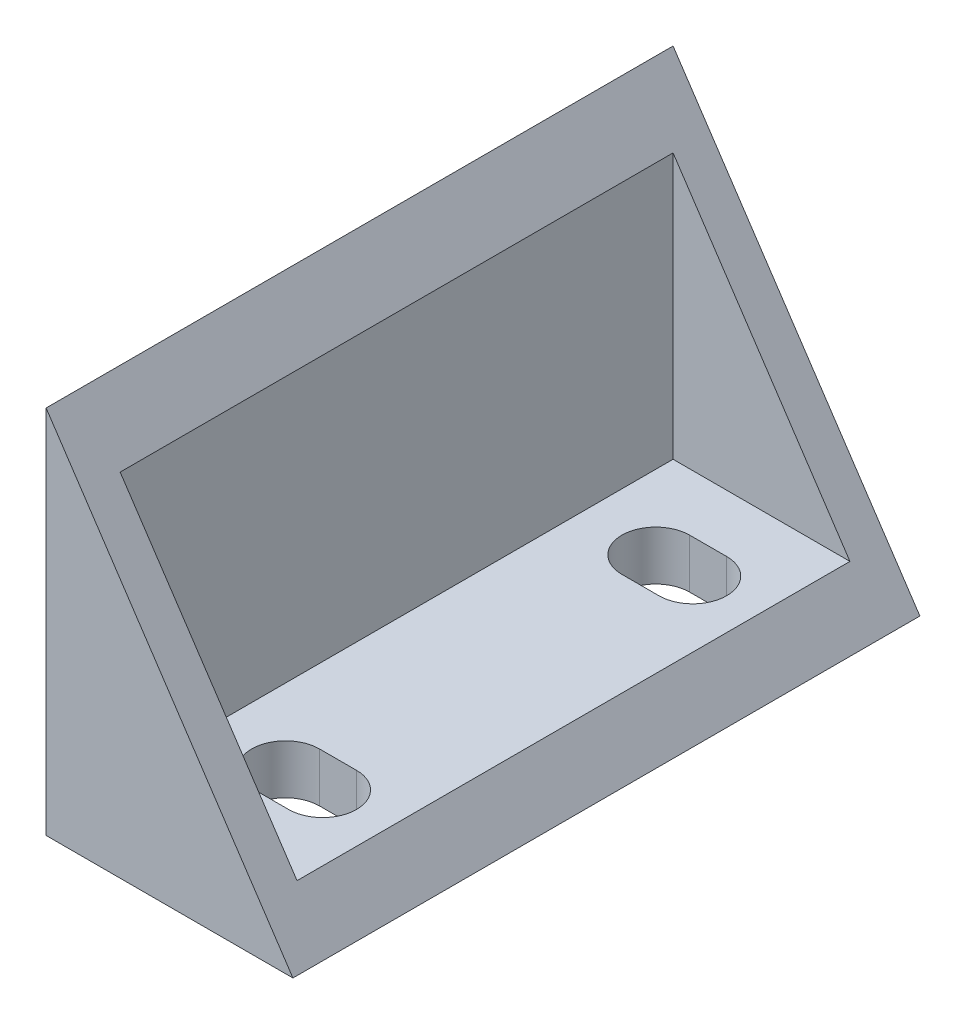
ISO-10303-21;
HEADER;
FILE_DESCRIPTION(('STEP AP214'),'2;1');
FILE_NAME('part.step','',(''),(''),'','','');
FILE_SCHEMA(('AUTOMOTIVE_DESIGN { 1 0 10303 214 1 1 1 1 }'));
ENDSEC;
DATA;
#1=APPLICATION_CONTEXT('core data for automotive mechanical design processes');
#2=APPLICATION_PROTOCOL_DEFINITION('international standard','automotive_design',2000,#1);
#3=PRODUCT_CONTEXT('',#1,'mechanical');
#4=PRODUCT('Part','Part','',(#3));
#5=PRODUCT_RELATED_PRODUCT_CATEGORY('part','',(#4));
#6=PRODUCT_DEFINITION_FORMATION('','',#4);
#7=PRODUCT_DEFINITION_CONTEXT('part definition',#1,'design');
#8=PRODUCT_DEFINITION('design','',#6,#7);
#9=PRODUCT_DEFINITION_SHAPE('','',#8);
#10=(LENGTH_UNIT() NAMED_UNIT(*) SI_UNIT(.MILLI.,.METRE.));
#11=(NAMED_UNIT(*) PLANE_ANGLE_UNIT() SI_UNIT($,.RADIAN.));
#12=(NAMED_UNIT(*) SI_UNIT($,.STERADIAN.) SOLID_ANGLE_UNIT());
#13=UNCERTAINTY_MEASURE_WITH_UNIT(LENGTH_MEASURE(1.E-05),#10,'distance_accuracy_value','');
#14=(GEOMETRIC_REPRESENTATION_CONTEXT(3) GLOBAL_UNCERTAINTY_ASSIGNED_CONTEXT((#13)) GLOBAL_UNIT_ASSIGNED_CONTEXT((#10,
#11,#12)) REPRESENTATION_CONTEXT('',''));
#15=CARTESIAN_POINT('',(0.,0.,0.));
#16=DIRECTION('',(0.,0.,1.));
#17=DIRECTION('',(1.,0.,0.));
#18=AXIS2_PLACEMENT_3D('',#15,#16,#17);
#19=CARTESIAN_POINT('',(0.,4.,0.));
#20=DIRECTION('',(0.,-1.,0.));
#21=DIRECTION('',(0.,0.,-1.));
#22=AXIS2_PLACEMENT_3D('',#19,#20,#21);
#23=PLANE('',#22);
#24=DIRECTION('',(1.,0.,0.));
#25=VECTOR('',#24,1.);
#26=CARTESIAN_POINT('',(9.00000000000001,4.,-12.25));
#27=LINE('',#26,#25);
#28=CARTESIAN_POINT('',(9.00000000000001,4.,-12.25));
#29=VERTEX_POINT('',#28);
#30=CARTESIAN_POINT('',(12.,4.,-12.25));
#31=VERTEX_POINT('',#30);
#32=EDGE_CURVE('E336',#29,#31,#27,.T.);
#33=ORIENTED_EDGE('',*,*,#32,.F.);
#34=CARTESIAN_POINT('',(9.00000000000001,4.,-15.));
#35=DIRECTION('',(0.,1.,0.));
#36=DIRECTION('',(0.,0.,1.));
#37=AXIS2_PLACEMENT_3D('',#34,#35,#36);
#38=CIRCLE('',#37,2.75);
#39=CARTESIAN_POINT('',(9.00000000000001,4.,-17.75));
#40=VERTEX_POINT('',#39);
#41=EDGE_CURVE('E351',#40,#29,#38,.T.);
#42=ORIENTED_EDGE('',*,*,#41,.F.);
#43=DIRECTION('',(1.,0.,0.));
#44=VECTOR('',#43,1.);
#45=CARTESIAN_POINT('',(9.00000000000001,4.,-17.75));
#46=LINE('',#45,#44);
#47=CARTESIAN_POINT('',(12.,4.,-17.75));
#48=VERTEX_POINT('',#47);
#49=EDGE_CURVE('E347',#40,#48,#46,.T.);
#50=ORIENTED_EDGE('',*,*,#49,.T.);
#51=CARTESIAN_POINT('',(12.,4.,-15.));
#52=DIRECTION('',(0.,1.,0.));
#53=DIRECTION('',(0.,0.,1.));
#54=AXIS2_PLACEMENT_3D('',#51,#52,#53);
#55=CIRCLE('',#54,2.75);
#56=EDGE_CURVE('E365',#31,#48,#55,.T.);
#57=ORIENTED_EDGE('',*,*,#56,.F.);
#58=EDGE_LOOP('',(#33,#42,#50,#57));
#59=FACE_BOUND('',#58,.T.);
#60=DIRECTION('',(-1.,0.,0.));
#61=VECTOR('',#60,1.);
#62=CARTESIAN_POINT('',(20.,4.,-22.4));
#63=LINE('',#62,#61);
#64=CARTESIAN_POINT('',(17.3333333333333,4.,-22.4));
#65=VERTEX_POINT('',#64);
#66=CARTESIAN_POINT('',(3.,4.,-22.4));
#67=VERTEX_POINT('',#66);
#68=EDGE_CURVE('E380',#65,#67,#63,.T.);
#69=ORIENTED_EDGE('',*,*,#68,.T.);
#70=DIRECTION('',(0.,0.,1.));
#71=VECTOR('',#70,1.);
#72=CARTESIAN_POINT('',(3.,4.,-22.4));
#73=LINE('',#72,#71);
#74=CARTESIAN_POINT('',(3.00000000000001,4.,22.4));
#75=VERTEX_POINT('',#74);
#76=EDGE_CURVE('E383',#67,#75,#73,.T.);
#77=ORIENTED_EDGE('',*,*,#76,.T.);
#78=DIRECTION('',(1.,0.,0.));
#79=VECTOR('',#78,1.);
#80=CARTESIAN_POINT('',(20.,4.,22.4));
#81=LINE('',#80,#79);
#82=CARTESIAN_POINT('',(17.3333333333333,4.,22.4));
#83=VERTEX_POINT('',#82);
#84=EDGE_CURVE('E387',#75,#83,#81,.T.);
#85=ORIENTED_EDGE('',*,*,#84,.T.);
#86=DIRECTION('',(0.,0.,1.));
#87=VECTOR('',#86,1.);
#88=CARTESIAN_POINT('',(17.3333333333333,4.,25.4));
#89=LINE('',#88,#87);
#90=EDGE_CURVE('E430',#65,#83,#89,.T.);
#91=ORIENTED_EDGE('',*,*,#90,.F.);
#92=EDGE_LOOP('',(#69,#77,#85,#91));
#93=FACE_BOUND('',#92,.T.);
#94=DIRECTION('',(1.,0.,0.));
#95=VECTOR('',#94,1.);
#96=CARTESIAN_POINT('',(9.00000000000001,4.,17.75));
#97=LINE('',#96,#95);
#98=CARTESIAN_POINT('',(9.00000000000001,4.,17.75));
#99=VERTEX_POINT('',#98);
#100=CARTESIAN_POINT('',(12.,4.,17.75));
#101=VERTEX_POINT('',#100);
#102=EDGE_CURVE('E317',#99,#101,#97,.T.);
#103=ORIENTED_EDGE('',*,*,#102,.F.);
#104=CARTESIAN_POINT('',(9.00000000000001,4.,15.));
#105=DIRECTION('',(0.,1.,0.));
#106=DIRECTION('',(0.,0.,1.));
#107=AXIS2_PLACEMENT_3D('',#104,#105,#106);
#108=CIRCLE('',#107,2.75);
#109=CARTESIAN_POINT('',(9.00000000000001,4.,12.25));
#110=VERTEX_POINT('',#109);
#111=EDGE_CURVE('E303',#110,#99,#108,.T.);
#112=ORIENTED_EDGE('',*,*,#111,.F.);
#113=DIRECTION('',(1.,0.,0.));
#114=VECTOR('',#113,1.);
#115=CARTESIAN_POINT('',(9.00000000000001,4.,12.25));
#116=LINE('',#115,#114);
#117=CARTESIAN_POINT('',(12.,4.,12.25));
#118=VERTEX_POINT('',#117);
#119=EDGE_CURVE('E294',#110,#118,#116,.T.);
#120=ORIENTED_EDGE('',*,*,#119,.T.);
#121=CARTESIAN_POINT('',(12.,4.,15.));
#122=DIRECTION('',(0.,1.,0.));
#123=DIRECTION('',(0.,0.,1.));
#124=AXIS2_PLACEMENT_3D('',#121,#122,#123);
#125=CIRCLE('',#124,2.75);
#126=EDGE_CURVE('E208',#101,#118,#125,.T.);
#127=ORIENTED_EDGE('',*,*,#126,.F.);
#128=EDGE_LOOP('',(#103,#112,#120,#127));
#129=FACE_BOUND('',#128,.T.);
#130=ADVANCED_FACE('F192',(#59,#93,#129),#23,.F.);
#131=CARTESIAN_POINT('',(20.,0.,25.4));
#132=DIRECTION('',(0.,1.,0.));
#133=DIRECTION('',(-1.,0.,0.));
#134=AXIS2_PLACEMENT_3D('',#131,#132,#133);
#135=PLANE('',#134);
#136=DIRECTION('',(1.,0.,0.));
#137=VECTOR('',#136,1.);
#138=CARTESIAN_POINT('',(20.,0.,-25.4));
#139=LINE('',#138,#137);
#140=CARTESIAN_POINT('',(0.,0.,-25.4));
#141=VERTEX_POINT('',#140);
#142=CARTESIAN_POINT('',(20.,0.,-25.4));
#143=VERTEX_POINT('',#142);
#144=EDGE_CURVE('E395',#141,#143,#139,.T.);
#145=ORIENTED_EDGE('',*,*,#144,.T.);
#146=DIRECTION('',(0.,0.,-1.));
#147=VECTOR('',#146,1.);
#148=CARTESIAN_POINT('',(20.,0.,25.4));
#149=LINE('',#148,#147);
#150=CARTESIAN_POINT('',(20.,0.,25.4));
#151=VERTEX_POINT('',#150);
#152=EDGE_CURVE('E426',#151,#143,#149,.T.);
#153=ORIENTED_EDGE('',*,*,#152,.F.);
#154=DIRECTION('',(1.,0.,0.));
#155=VECTOR('',#154,1.);
#156=CARTESIAN_POINT('',(20.,0.,25.4));
#157=LINE('',#156,#155);
#158=CARTESIAN_POINT('',(0.,0.,25.4));
#159=VERTEX_POINT('',#158);
#160=EDGE_CURVE('E399',#159,#151,#157,.T.);
#161=ORIENTED_EDGE('',*,*,#160,.F.);
#162=DIRECTION('',(0.,0.,-1.));
#163=VECTOR('',#162,1.);
#164=CARTESIAN_POINT('',(0.,0.,25.4));
#165=LINE('',#164,#163);
#166=EDGE_CURVE('E410',#159,#141,#165,.T.);
#167=ORIENTED_EDGE('',*,*,#166,.T.);
#168=EDGE_LOOP('',(#145,#153,#161,#167));
#169=FACE_BOUND('',#168,.T.);
#170=DIRECTION('',(1.,0.,0.));
#171=VECTOR('',#170,1.);
#172=CARTESIAN_POINT('',(9.00000000000001,0.,-17.75));
#173=LINE('',#172,#171);
#174=CARTESIAN_POINT('',(9.00000000000001,0.,-17.75));
#175=VERTEX_POINT('',#174);
#176=CARTESIAN_POINT('',(12.,0.,-17.75));
#177=VERTEX_POINT('',#176);
#178=EDGE_CURVE('E343',#175,#177,#173,.T.);
#179=ORIENTED_EDGE('',*,*,#178,.F.);
#180=CARTESIAN_POINT('',(9.00000000000001,0.,-15.));
#181=DIRECTION('',(0.,1.,0.));
#182=DIRECTION('',(0.,0.,1.));
#183=AXIS2_PLACEMENT_3D('',#180,#181,#182);
#184=CIRCLE('',#183,2.75);
#185=CARTESIAN_POINT('',(9.00000000000001,0.,-12.25));
#186=VERTEX_POINT('',#185);
#187=EDGE_CURVE('E355',#175,#186,#184,.T.);
#188=ORIENTED_EDGE('',*,*,#187,.T.);
#189=DIRECTION('',(1.,0.,0.));
#190=VECTOR('',#189,1.);
#191=CARTESIAN_POINT('',(9.00000000000001,0.,-12.25));
#192=LINE('',#191,#190);
#193=CARTESIAN_POINT('',(12.,0.,-12.25));
#194=VERTEX_POINT('',#193);
#195=EDGE_CURVE('E339',#186,#194,#192,.T.);
#196=ORIENTED_EDGE('',*,*,#195,.T.);
#197=CARTESIAN_POINT('',(12.,0.,-15.));
#198=DIRECTION('',(0.,1.,0.));
#199=DIRECTION('',(0.,0.,1.));
#200=AXIS2_PLACEMENT_3D('',#197,#198,#199);
#201=CIRCLE('',#200,2.75);
#202=EDGE_CURVE('E369',#194,#177,#201,.T.);
#203=ORIENTED_EDGE('',*,*,#202,.T.);
#204=EDGE_LOOP('',(#179,#188,#196,#203));
#205=FACE_BOUND('',#204,.T.);
#206=DIRECTION('',(1.,0.,0.));
#207=VECTOR('',#206,1.);
#208=CARTESIAN_POINT('',(9.00000000000001,0.,12.25));
#209=LINE('',#208,#207);
#210=CARTESIAN_POINT('',(9.00000000000001,0.,12.25));
#211=VERTEX_POINT('',#210);
#212=CARTESIAN_POINT('',(12.,0.,12.25));
#213=VERTEX_POINT('',#212);
#214=EDGE_CURVE('E304',#211,#213,#209,.T.);
#215=ORIENTED_EDGE('',*,*,#214,.F.);
#216=CARTESIAN_POINT('',(9.00000000000001,0.,15.));
#217=DIRECTION('',(0.,1.,0.));
#218=DIRECTION('',(0.,0.,1.));
#219=AXIS2_PLACEMENT_3D('',#216,#217,#218);
#220=CIRCLE('',#219,2.75);
#221=CARTESIAN_POINT('',(9.00000000000001,0.,17.75));
#222=VERTEX_POINT('',#221);
#223=EDGE_CURVE('E312',#211,#222,#220,.T.);
#224=ORIENTED_EDGE('',*,*,#223,.T.);
#225=DIRECTION('',(1.,0.,0.));
#226=VECTOR('',#225,1.);
#227=CARTESIAN_POINT('',(9.00000000000001,0.,17.75));
#228=LINE('',#227,#226);
#229=CARTESIAN_POINT('',(12.,0.,17.75));
#230=VERTEX_POINT('',#229);
#231=EDGE_CURVE('E609',#222,#230,#228,.T.);
#232=ORIENTED_EDGE('',*,*,#231,.T.);
#233=CARTESIAN_POINT('',(12.,0.,15.));
#234=DIRECTION('',(0.,1.,0.));
#235=DIRECTION('',(0.,0.,1.));
#236=AXIS2_PLACEMENT_3D('',#233,#234,#235);
#237=CIRCLE('',#236,2.75);
#238=EDGE_CURVE('E328',#230,#213,#237,.T.);
#239=ORIENTED_EDGE('',*,*,#238,.T.);
#240=EDGE_LOOP('',(#215,#224,#232,#239));
#241=FACE_BOUND('',#240,.T.);
#242=ADVANCED_FACE('F194',(#169,#205,#241),#135,.F.);
#243=CARTESIAN_POINT('',(0.,30.,25.4));
#244=DIRECTION('',(-0.832050294337844,-0.554700196225229,0.));
#245=DIRECTION('',(0.554700196225229,-0.832050294337844,0.));
#246=AXIS2_PLACEMENT_3D('',#243,#244,#245);
#247=PLANE('',#246);
#248=ORIENTED_EDGE('',*,*,#90,.T.);
#249=DIRECTION('',(-0.554700196225229,0.832050294337844,0.));
#250=VECTOR('',#249,1.);
#251=CARTESIAN_POINT('',(0.,30.,22.4));
#252=LINE('',#251,#250);
#253=CARTESIAN_POINT('',(3.00000000000001,25.5,22.4));
#254=VERTEX_POINT('',#253);
#255=EDGE_CURVE('E13',#83,#254,#252,.T.);
#256=ORIENTED_EDGE('',*,*,#255,.T.);
#257=DIRECTION('',(0.,0.,-1.));
#258=VECTOR('',#257,1.);
#259=CARTESIAN_POINT('',(3.00000000000001,25.5,25.4));
#260=LINE('',#259,#258);
#261=CARTESIAN_POINT('',(3.,25.5,-22.4));
#262=VERTEX_POINT('',#261);
#263=EDGE_CURVE('E201',#254,#262,#260,.T.);
#264=ORIENTED_EDGE('',*,*,#263,.T.);
#265=DIRECTION('',(0.554700196225229,-0.832050294337844,0.));
#266=VECTOR('',#265,1.);
#267=CARTESIAN_POINT('',(0.,30.,-22.4));
#268=LINE('',#267,#266);
#269=EDGE_CURVE('E434',#262,#65,#268,.T.);
#270=ORIENTED_EDGE('',*,*,#269,.T.);
#271=EDGE_LOOP('',(#248,#256,#264,#270));
#272=FACE_BOUND('',#271,.T.);
#273=DIRECTION('',(-0.554700196225229,0.832050294337844,0.));
#274=VECTOR('',#273,1.);
#275=CARTESIAN_POINT('',(0.,30.,-25.4));
#276=LINE('',#275,#274);
#277=CARTESIAN_POINT('',(0.,30.,-25.4));
#278=VERTEX_POINT('',#277);
#279=EDGE_CURVE('E414',#143,#278,#276,.T.);
#280=ORIENTED_EDGE('',*,*,#279,.T.);
#281=DIRECTION('',(0.,0.,-1.));
#282=VECTOR('',#281,1.);
#283=CARTESIAN_POINT('',(0.,30.,25.4));
#284=LINE('',#283,#282);
#285=CARTESIAN_POINT('',(0.,30.,25.4));
#286=VERTEX_POINT('',#285);
#287=EDGE_CURVE('E422',#286,#278,#284,.T.);
#288=ORIENTED_EDGE('',*,*,#287,.F.);
#289=DIRECTION('',(-0.554700196225229,0.832050294337844,0.));
#290=VECTOR('',#289,1.);
#291=CARTESIAN_POINT('',(0.,30.,25.4));
#292=LINE('',#291,#290);
#293=EDGE_CURVE('E403',#151,#286,#292,.T.);
#294=ORIENTED_EDGE('',*,*,#293,.F.);
#295=ORIENTED_EDGE('',*,*,#152,.T.);
#296=EDGE_LOOP('',(#280,#288,#294,#295));
#297=FACE_BOUND('',#296,.T.);
#298=ADVANCED_FACE('F440',(#272,#297),#247,.F.);
#299=CARTESIAN_POINT('',(0.,0.,25.4));
#300=DIRECTION('',(1.,0.,0.));
#301=DIRECTION('',(0.,0.,-1.));
#302=AXIS2_PLACEMENT_3D('',#299,#300,#301);
#303=PLANE('',#302);
#304=DIRECTION('',(0.,-1.,0.));
#305=VECTOR('',#304,1.);
#306=CARTESIAN_POINT('',(0.,0.,-25.4));
#307=LINE('',#306,#305);
#308=EDGE_CURVE('E404',#278,#141,#307,.T.);
#309=ORIENTED_EDGE('',*,*,#308,.T.);
#310=ORIENTED_EDGE('',*,*,#166,.F.);
#311=DIRECTION('',(0.,-1.,0.));
#312=VECTOR('',#311,1.);
#313=CARTESIAN_POINT('',(0.,0.,25.4));
#314=LINE('',#313,#312);
#315=EDGE_CURVE('E407',#286,#159,#314,.T.);
#316=ORIENTED_EDGE('',*,*,#315,.F.);
#317=ORIENTED_EDGE('',*,*,#287,.T.);
#318=EDGE_LOOP('',(#309,#310,#316,#317));
#319=FACE_BOUND('',#318,.T.);
#320=ADVANCED_FACE('F488',(#319),#303,.F.);
#321=CARTESIAN_POINT('',(0.,0.,25.4));
#322=DIRECTION('',(0.,0.,-1.));
#323=DIRECTION('',(-1.,0.,0.));
#324=AXIS2_PLACEMENT_3D('',#321,#322,#323);
#325=PLANE('',#324);
#326=ORIENTED_EDGE('',*,*,#160,.T.);
#327=ORIENTED_EDGE('',*,*,#293,.T.);
#328=ORIENTED_EDGE('',*,*,#315,.T.);
#329=EDGE_LOOP('',(#326,#327,#328));
#330=FACE_BOUND('',#329,.T.);
#331=ADVANCED_FACE('F482',(#330),#325,.F.);
#332=CARTESIAN_POINT('',(0.,0.,-25.4));
#333=DIRECTION('',(0.,0.,-1.));
#334=DIRECTION('',(-1.,0.,0.));
#335=AXIS2_PLACEMENT_3D('',#332,#333,#334);
#336=PLANE('',#335);
#337=ORIENTED_EDGE('',*,*,#144,.F.);
#338=ORIENTED_EDGE('',*,*,#308,.F.);
#339=ORIENTED_EDGE('',*,*,#279,.F.);
#340=EDGE_LOOP('',(#337,#338,#339));
#341=FACE_BOUND('',#340,.T.);
#342=ADVANCED_FACE('F477',(#341),#336,.T.);
#343=CARTESIAN_POINT('',(20.,4.,22.4));
#344=DIRECTION('',(0.,0.,1.));
#345=DIRECTION('',(1.,0.,0.));
#346=AXIS2_PLACEMENT_3D('',#343,#344,#345);
#347=PLANE('',#346);
#348=ORIENTED_EDGE('',*,*,#84,.F.);
#349=DIRECTION('',(0.,1.,0.));
#350=VECTOR('',#349,1.);
#351=CARTESIAN_POINT('',(3.00000000000001,4.,22.4));
#352=LINE('',#351,#350);
#353=EDGE_CURVE('E391',#75,#254,#352,.T.);
#354=ORIENTED_EDGE('',*,*,#353,.T.);
#355=ORIENTED_EDGE('',*,*,#255,.F.);
#356=EDGE_LOOP('',(#348,#354,#355));
#357=FACE_BOUND('',#356,.T.);
#358=ADVANCED_FACE('F449',(#357),#347,.F.);
#359=CARTESIAN_POINT('',(3.,4.,-22.4));
#360=DIRECTION('',(-1.,0.,0.));
#361=DIRECTION('',(0.,0.,1.));
#362=AXIS2_PLACEMENT_3D('',#359,#360,#361);
#363=PLANE('',#362);
#364=ORIENTED_EDGE('',*,*,#353,.F.);
#365=ORIENTED_EDGE('',*,*,#76,.F.);
#366=DIRECTION('',(0.,1.,0.));
#367=VECTOR('',#366,1.);
#368=CARTESIAN_POINT('',(3.,4.,-22.4));
#369=LINE('',#368,#367);
#370=EDGE_CURVE('E390',#67,#262,#369,.T.);
#371=ORIENTED_EDGE('',*,*,#370,.T.);
#372=ORIENTED_EDGE('',*,*,#263,.F.);
#373=EDGE_LOOP('',(#364,#365,#371,#372));
#374=FACE_BOUND('',#373,.T.);
#375=ADVANCED_FACE('F444',(#374),#363,.F.);
#376=CARTESIAN_POINT('',(20.,4.,-22.4));
#377=DIRECTION('',(0.,0.,-1.));
#378=DIRECTION('',(-1.,0.,0.));
#379=AXIS2_PLACEMENT_3D('',#376,#377,#378);
#380=PLANE('',#379);
#381=ORIENTED_EDGE('',*,*,#370,.F.);
#382=ORIENTED_EDGE('',*,*,#68,.F.);
#383=ORIENTED_EDGE('',*,*,#269,.F.);
#384=EDGE_LOOP('',(#381,#382,#383));
#385=FACE_BOUND('',#384,.T.);
#386=ADVANCED_FACE('F453',(#385),#380,.F.);
#387=CARTESIAN_POINT('',(12.,4.,-15.));
#388=DIRECTION('',(0.,1.,0.));
#389=DIRECTION('',(0.,0.,1.));
#390=AXIS2_PLACEMENT_3D('',#387,#388,#389);
#391=CYLINDRICAL_SURFACE('',#390,2.75);
#392=ORIENTED_EDGE('',*,*,#202,.F.);
#393=DIRECTION('',(0.,1.,0.));
#394=VECTOR('',#393,1.);
#395=CARTESIAN_POINT('',(12.,4.,-12.25));
#396=LINE('',#395,#394);
#397=EDGE_CURVE('E376',#31,#194,#396,.F.);
#398=ORIENTED_EDGE('',*,*,#397,.F.);
#399=ORIENTED_EDGE('',*,*,#56,.T.);
#400=DIRECTION('',(0.,1.,0.));
#401=VECTOR('',#400,1.);
#402=CARTESIAN_POINT('',(12.,4.,-17.75));
#403=LINE('',#402,#401);
#404=EDGE_CURVE('E373',#177,#48,#403,.T.);
#405=ORIENTED_EDGE('',*,*,#404,.F.);
#406=EDGE_LOOP('',(#392,#398,#399,#405));
#407=FACE_BOUND('',#406,.T.);
#408=ADVANCED_FACE('F455',(#407),#391,.F.);
#409=CARTESIAN_POINT('',(9.00000000000001,4.,-15.));
#410=DIRECTION('',(0.,1.,0.));
#411=DIRECTION('',(0.,0.,1.));
#412=AXIS2_PLACEMENT_3D('',#409,#410,#411);
#413=CYLINDRICAL_SURFACE('',#412,2.75);
#414=ORIENTED_EDGE('',*,*,#41,.T.);
#415=DIRECTION('',(0.,1.,0.));
#416=VECTOR('',#415,1.);
#417=CARTESIAN_POINT('',(9.00000000000001,4.,-12.25));
#418=LINE('',#417,#416);
#419=EDGE_CURVE('E359',#186,#29,#418,.T.);
#420=ORIENTED_EDGE('',*,*,#419,.F.);
#421=ORIENTED_EDGE('',*,*,#187,.F.);
#422=DIRECTION('',(0.,1.,0.));
#423=VECTOR('',#422,1.);
#424=CARTESIAN_POINT('',(9.00000000000001,4.,-17.75));
#425=LINE('',#424,#423);
#426=EDGE_CURVE('E362',#40,#175,#425,.F.);
#427=ORIENTED_EDGE('',*,*,#426,.F.);
#428=EDGE_LOOP('',(#414,#420,#421,#427));
#429=FACE_BOUND('',#428,.T.);
#430=ADVANCED_FACE('F462',(#429),#413,.F.);
#431=CARTESIAN_POINT('',(9.00000000000001,4.,-17.75));
#432=DIRECTION('',(0.,0.,-1.));
#433=DIRECTION('',(-1.,0.,0.));
#434=AXIS2_PLACEMENT_3D('',#431,#432,#433);
#435=PLANE('',#434);
#436=ORIENTED_EDGE('',*,*,#404,.T.);
#437=ORIENTED_EDGE('',*,*,#49,.F.);
#438=ORIENTED_EDGE('',*,*,#426,.T.);
#439=ORIENTED_EDGE('',*,*,#178,.T.);
#440=EDGE_LOOP('',(#436,#437,#438,#439));
#441=FACE_BOUND('',#440,.T.);
#442=ADVANCED_FACE('F551',(#441),#435,.F.);
#443=CARTESIAN_POINT('',(9.00000000000001,4.,-12.25));
#444=DIRECTION('',(0.,0.,1.));
#445=DIRECTION('',(1.,0.,0.));
#446=AXIS2_PLACEMENT_3D('',#443,#444,#445);
#447=PLANE('',#446);
#448=ORIENTED_EDGE('',*,*,#397,.T.);
#449=ORIENTED_EDGE('',*,*,#195,.F.);
#450=ORIENTED_EDGE('',*,*,#419,.T.);
#451=ORIENTED_EDGE('',*,*,#32,.T.);
#452=EDGE_LOOP('',(#448,#449,#450,#451));
#453=FACE_BOUND('',#452,.T.);
#454=ADVANCED_FACE('F560',(#453),#447,.F.);
#455=CARTESIAN_POINT('',(12.,4.,15.));
#456=DIRECTION('',(0.,1.,0.));
#457=DIRECTION('',(0.,0.,1.));
#458=AXIS2_PLACEMENT_3D('',#455,#456,#457);
#459=CYLINDRICAL_SURFACE('',#458,2.75);
#460=ORIENTED_EDGE('',*,*,#238,.F.);
#461=DIRECTION('',(0.,1.,0.));
#462=VECTOR('',#461,1.);
#463=CARTESIAN_POINT('',(12.,4.,17.75));
#464=LINE('',#463,#462);
#465=EDGE_CURVE('E215',#101,#230,#464,.F.);
#466=ORIENTED_EDGE('',*,*,#465,.F.);
#467=ORIENTED_EDGE('',*,*,#126,.T.);
#468=DIRECTION('',(0.,1.,0.));
#469=VECTOR('',#468,1.);
#470=CARTESIAN_POINT('',(12.,4.,12.25));
#471=LINE('',#470,#469);
#472=EDGE_CURVE('E299',#213,#118,#471,.T.);
#473=ORIENTED_EDGE('',*,*,#472,.F.);
#474=EDGE_LOOP('',(#460,#466,#467,#473));
#475=FACE_BOUND('',#474,.T.);
#476=ADVANCED_FACE('F570',(#475),#459,.F.);
#477=CARTESIAN_POINT('',(9.00000000000001,4.,15.));
#478=DIRECTION('',(0.,1.,0.));
#479=DIRECTION('',(0.,0.,1.));
#480=AXIS2_PLACEMENT_3D('',#477,#478,#479);
#481=CYLINDRICAL_SURFACE('',#480,2.75);
#482=ORIENTED_EDGE('',*,*,#111,.T.);
#483=DIRECTION('',(0.,1.,0.));
#484=VECTOR('',#483,1.);
#485=CARTESIAN_POINT('',(9.00000000000001,4.,17.75));
#486=LINE('',#485,#484);
#487=EDGE_CURVE('E315',#222,#99,#486,.T.);
#488=ORIENTED_EDGE('',*,*,#487,.F.);
#489=ORIENTED_EDGE('',*,*,#223,.F.);
#490=DIRECTION('',(0.,1.,0.));
#491=VECTOR('',#490,1.);
#492=CARTESIAN_POINT('',(9.00000000000001,4.,12.25));
#493=LINE('',#492,#491);
#494=EDGE_CURVE('E297',#110,#211,#493,.F.);
#495=ORIENTED_EDGE('',*,*,#494,.F.);
#496=EDGE_LOOP('',(#482,#488,#489,#495));
#497=FACE_BOUND('',#496,.T.);
#498=ADVANCED_FACE('F308',(#497),#481,.F.);
#499=CARTESIAN_POINT('',(9.00000000000001,4.,12.25));
#500=DIRECTION('',(0.,0.,-1.));
#501=DIRECTION('',(-1.,0.,0.));
#502=AXIS2_PLACEMENT_3D('',#499,#500,#501);
#503=PLANE('',#502);
#504=ORIENTED_EDGE('',*,*,#472,.T.);
#505=ORIENTED_EDGE('',*,*,#119,.F.);
#506=ORIENTED_EDGE('',*,*,#494,.T.);
#507=ORIENTED_EDGE('',*,*,#214,.T.);
#508=EDGE_LOOP('',(#504,#505,#506,#507));
#509=FACE_BOUND('',#508,.T.);
#510=ADVANCED_FACE('F296',(#509),#503,.F.);
#511=CARTESIAN_POINT('',(9.00000000000001,4.,17.75));
#512=DIRECTION('',(0.,0.,1.));
#513=DIRECTION('',(1.,0.,0.));
#514=AXIS2_PLACEMENT_3D('',#511,#512,#513);
#515=PLANE('',#514);
#516=ORIENTED_EDGE('',*,*,#465,.T.);
#517=ORIENTED_EDGE('',*,*,#231,.F.);
#518=ORIENTED_EDGE('',*,*,#487,.T.);
#519=ORIENTED_EDGE('',*,*,#102,.T.);
#520=EDGE_LOOP('',(#516,#517,#518,#519));
#521=FACE_BOUND('',#520,.T.);
#522=ADVANCED_FACE('F596',(#521),#515,.F.);
#523=CLOSED_SHELL('',(#130,#242,#298,#320,#331,#342,#358,#375,#386,#408,#430,#442,#454,#476,
#498,#510,#522));
#524=MANIFOLD_SOLID_BREP('B2',#523);
#525=ADVANCED_BREP_SHAPE_REPRESENTATION('',(#18,#524),#14);
#526=SHAPE_DEFINITION_REPRESENTATION(#9,#525);
ENDSEC;
END-ISO-10303-21;
